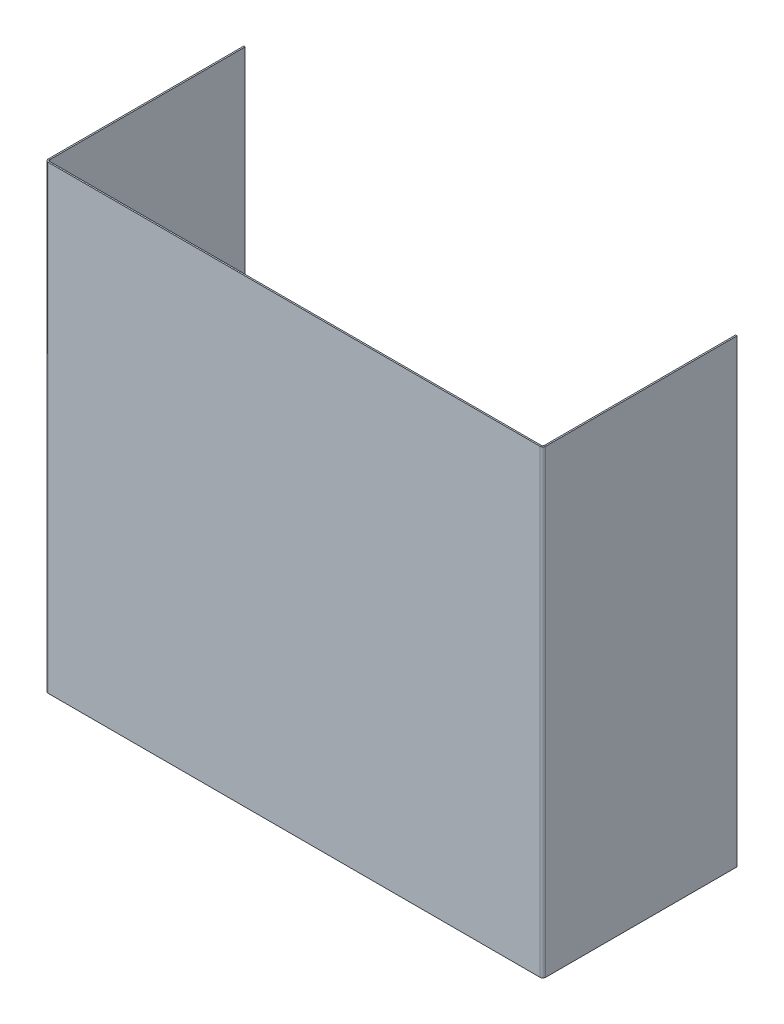
ISO-10303-21;
HEADER;
FILE_DESCRIPTION(('STEP AP214'),'2;1');
FILE_NAME('part.step','',(''),(''),'','','');
FILE_SCHEMA(('AUTOMOTIVE_DESIGN { 1 0 10303 214 1 1 1 1 }'));
ENDSEC;
DATA;
#1=APPLICATION_CONTEXT('core data for automotive mechanical design processes');
#2=APPLICATION_PROTOCOL_DEFINITION('international standard','automotive_design',2000,#1);
#3=PRODUCT_CONTEXT('',#1,'mechanical');
#4=PRODUCT('Part','Part','',(#3));
#5=PRODUCT_RELATED_PRODUCT_CATEGORY('part','',(#4));
#6=PRODUCT_DEFINITION_FORMATION('','',#4);
#7=PRODUCT_DEFINITION_CONTEXT('part definition',#1,'design');
#8=PRODUCT_DEFINITION('design','',#6,#7);
#9=PRODUCT_DEFINITION_SHAPE('','',#8);
#10=(LENGTH_UNIT() NAMED_UNIT(*) SI_UNIT(.MILLI.,.METRE.));
#11=(NAMED_UNIT(*) PLANE_ANGLE_UNIT() SI_UNIT($,.RADIAN.));
#12=(NAMED_UNIT(*) SI_UNIT($,.STERADIAN.) SOLID_ANGLE_UNIT());
#13=UNCERTAINTY_MEASURE_WITH_UNIT(LENGTH_MEASURE(1.E-05),#10,'distance_accuracy_value','');
#14=(GEOMETRIC_REPRESENTATION_CONTEXT(3) GLOBAL_UNCERTAINTY_ASSIGNED_CONTEXT((#13)) GLOBAL_UNIT_ASSIGNED_CONTEXT((#10,
#11,#12)) REPRESENTATION_CONTEXT('',''));
#15=CARTESIAN_POINT('',(0.,0.,0.));
#16=DIRECTION('',(0.,0.,1.));
#17=DIRECTION('',(1.,0.,0.));
#18=AXIS2_PLACEMENT_3D('',#15,#16,#17);
#19=CARTESIAN_POINT('',(0.736600000000012,238.,102.));
#20=DIRECTION('',(0.,1.,0.));
#21=DIRECTION('',(0.,0.,1.));
#22=AXIS2_PLACEMENT_3D('',#19,#20,#21);
#23=PLANE('',#22);
#24=DIRECTION('',(0.,0.,1.));
#25=VECTOR('',#24,1.);
#26=CARTESIAN_POINT('',(0.736600000000012,238.,102.));
#27=LINE('',#26,#25);
#28=CARTESIAN_POINT('',(0.736600000000012,238.,102.));
#29=VERTEX_POINT('',#28);
#30=CARTESIAN_POINT('',(0.736600000000012,238.,102.7366));
#31=VERTEX_POINT('',#30);
#32=EDGE_CURVE('E11',#29,#31,#27,.T.);
#33=ORIENTED_EDGE('',*,*,#32,.F.);
#34=CARTESIAN_POINT('',(0.736600000000012,238.,101.2634));
#35=DIRECTION('',(0.,-1.,0.));
#36=DIRECTION('',(0.,0.,-1.));
#37=AXIS2_PLACEMENT_3D('',#34,#35,#36);
#38=CIRCLE('',#37,0.7366);
#39=CARTESIAN_POINT('',(0.,238.,101.2634));
#40=VERTEX_POINT('',#39);
#41=EDGE_CURVE('E249',#40,#29,#38,.F.);
#42=ORIENTED_EDGE('',*,*,#41,.F.);
#43=DIRECTION('',(1.,0.,0.));
#44=VECTOR('',#43,1.);
#45=CARTESIAN_POINT('',(-0.736599999999988,238.,101.2634));
#46=LINE('',#45,#44);
#47=CARTESIAN_POINT('',(-0.736599999999988,238.,101.2634));
#48=VERTEX_POINT('',#47);
#49=EDGE_CURVE('E47',#48,#40,#46,.T.);
#50=ORIENTED_EDGE('',*,*,#49,.F.);
#51=CARTESIAN_POINT('',(0.736600000000012,238.,101.2634));
#52=DIRECTION('',(0.,1.,0.));
#53=DIRECTION('',(1.,0.,0.));
#54=AXIS2_PLACEMENT_3D('',#51,#52,#53);
#55=CIRCLE('',#54,1.4732);
#56=EDGE_CURVE('E148',#48,#31,#55,.T.);
#57=ORIENTED_EDGE('',*,*,#56,.T.);
#58=EDGE_LOOP('',(#33,#42,#50,#57));
#59=FACE_BOUND('',#58,.T.);
#60=ADVANCED_FACE('F39',(#59),#23,.T.);
#61=CARTESIAN_POINT('',(-0.736599999999988,238.,101.2634));
#62=DIRECTION('',(0.,1.,0.));
#63=DIRECTION('',(0.,0.,1.));
#64=AXIS2_PLACEMENT_3D('',#61,#62,#63);
#65=PLANE('',#64);
#66=DIRECTION('',(1.,0.,0.));
#67=VECTOR('',#66,1.);
#68=CARTESIAN_POINT('',(0.,238.,102.));
#69=LINE('',#68,#67);
#70=CARTESIAN_POINT('',(255.2634,238.,102.));
#71=VERTEX_POINT('',#70);
#72=EDGE_CURVE('E142',#29,#71,#69,.T.);
#73=ORIENTED_EDGE('',*,*,#72,.F.);
#74=ORIENTED_EDGE('',*,*,#32,.T.);
#75=DIRECTION('',(1.,0.,0.));
#76=VECTOR('',#75,1.);
#77=CARTESIAN_POINT('',(0.,238.,102.7366));
#78=LINE('',#77,#76);
#79=CARTESIAN_POINT('',(255.2634,238.,102.7366));
#80=VERTEX_POINT('',#79);
#81=EDGE_CURVE('E139',#31,#80,#78,.T.);
#82=ORIENTED_EDGE('',*,*,#81,.T.);
#83=DIRECTION('',(0.,0.,-1.));
#84=VECTOR('',#83,1.);
#85=CARTESIAN_POINT('',(255.2634,238.,102.7366));
#86=LINE('',#85,#84);
#87=EDGE_CURVE('E230',#80,#71,#86,.T.);
#88=ORIENTED_EDGE('',*,*,#87,.T.);
#89=EDGE_LOOP('',(#73,#74,#82,#88));
#90=FACE_BOUND('',#89,.T.);
#91=ADVANCED_FACE('F137',(#90),#65,.T.);
#92=CARTESIAN_POINT('',(0.,0.,101.2634));
#93=DIRECTION('',(0.,-1.,0.));
#94=DIRECTION('',(0.,0.,-1.));
#95=AXIS2_PLACEMENT_3D('',#92,#93,#94);
#96=PLANE('',#95);
#97=DIRECTION('',(-1.,0.,0.));
#98=VECTOR('',#97,1.);
#99=CARTESIAN_POINT('',(0.,0.,101.2634));
#100=LINE('',#99,#98);
#101=CARTESIAN_POINT('',(0.,0.,101.2634));
#102=VERTEX_POINT('',#101);
#103=CARTESIAN_POINT('',(-0.736599999999988,0.,101.2634));
#104=VERTEX_POINT('',#103);
#105=EDGE_CURVE('E235',#102,#104,#100,.T.);
#106=ORIENTED_EDGE('',*,*,#105,.F.);
#107=CARTESIAN_POINT('',(0.736600000000012,0.,101.2634));
#108=DIRECTION('',(0.,-1.,0.));
#109=DIRECTION('',(0.,0.,-1.));
#110=AXIS2_PLACEMENT_3D('',#107,#108,#109);
#111=CIRCLE('',#110,0.7366);
#112=CARTESIAN_POINT('',(0.736600000000012,0.,102.));
#113=VERTEX_POINT('',#112);
#114=EDGE_CURVE('E187',#102,#113,#111,.F.);
#115=ORIENTED_EDGE('',*,*,#114,.T.);
#116=DIRECTION('',(0.,0.,-1.));
#117=VECTOR('',#116,1.);
#118=CARTESIAN_POINT('',(0.736600000000012,0.,102.7366));
#119=LINE('',#118,#117);
#120=CARTESIAN_POINT('',(0.736600000000012,0.,102.7366));
#121=VERTEX_POINT('',#120);
#122=EDGE_CURVE('E233',#121,#113,#119,.T.);
#123=ORIENTED_EDGE('',*,*,#122,.F.);
#124=CARTESIAN_POINT('',(0.736600000000012,0.,101.2634));
#125=DIRECTION('',(0.,1.,0.));
#126=DIRECTION('',(1.,0.,0.));
#127=AXIS2_PLACEMENT_3D('',#124,#125,#126);
#128=CIRCLE('',#127,1.4732);
#129=EDGE_CURVE('E160',#104,#121,#128,.T.);
#130=ORIENTED_EDGE('',*,*,#129,.F.);
#131=EDGE_LOOP('',(#106,#115,#123,#130));
#132=FACE_BOUND('',#131,.T.);
#133=ADVANCED_FACE('F287',(#132),#96,.T.);
#134=CARTESIAN_POINT('',(0.736600000000012,0.,102.7366));
#135=DIRECTION('',(0.,-1.,0.));
#136=DIRECTION('',(0.,0.,-1.));
#137=AXIS2_PLACEMENT_3D('',#134,#135,#136);
#138=PLANE('',#137);
#139=DIRECTION('',(0.,0.,1.));
#140=VECTOR('',#139,1.);
#141=CARTESIAN_POINT('',(0.,0.,0.));
#142=LINE('',#141,#140);
#143=CARTESIAN_POINT('',(0.,0.,0.));
#144=VERTEX_POINT('',#143);
#145=EDGE_CURVE('E190',#144,#102,#142,.T.);
#146=ORIENTED_EDGE('',*,*,#145,.T.);
#147=ORIENTED_EDGE('',*,*,#105,.T.);
#148=DIRECTION('',(0.,0.,1.));
#149=VECTOR('',#148,1.);
#150=CARTESIAN_POINT('',(-0.7366,0.,0.));
#151=LINE('',#150,#149);
#152=CARTESIAN_POINT('',(-0.7366,0.,0.));
#153=VERTEX_POINT('',#152);
#154=EDGE_CURVE('E196',#153,#104,#151,.T.);
#155=ORIENTED_EDGE('',*,*,#154,.F.);
#156=DIRECTION('',(1.,0.,0.));
#157=VECTOR('',#156,1.);
#158=CARTESIAN_POINT('',(-0.7366,0.,0.));
#159=LINE('',#158,#157);
#160=EDGE_CURVE('E193',#153,#144,#159,.T.);
#161=ORIENTED_EDGE('',*,*,#160,.T.);
#162=EDGE_LOOP('',(#146,#147,#155,#161));
#163=FACE_BOUND('',#162,.T.);
#164=ADVANCED_FACE('F290',(#163),#138,.T.);
#165=CARTESIAN_POINT('',(256.,238.,101.2634));
#166=DIRECTION('',(0.,1.,0.));
#167=DIRECTION('',(0.,0.,1.));
#168=AXIS2_PLACEMENT_3D('',#165,#166,#167);
#169=PLANE('',#168);
#170=DIRECTION('',(1.,0.,0.));
#171=VECTOR('',#170,1.);
#172=CARTESIAN_POINT('',(256.,238.,101.2634));
#173=LINE('',#172,#171);
#174=CARTESIAN_POINT('',(256.,238.,101.2634));
#175=VERTEX_POINT('',#174);
#176=CARTESIAN_POINT('',(256.7366,238.,101.2634));
#177=VERTEX_POINT('',#176);
#178=EDGE_CURVE('E55',#175,#177,#173,.T.);
#179=ORIENTED_EDGE('',*,*,#178,.F.);
#180=CARTESIAN_POINT('',(255.2634,238.,101.2634));
#181=DIRECTION('',(0.,-1.,0.));
#182=DIRECTION('',(0.,0.,-1.));
#183=AXIS2_PLACEMENT_3D('',#180,#181,#182);
#184=CIRCLE('',#183,0.7366);
#185=EDGE_CURVE('E259',#71,#175,#184,.F.);
#186=ORIENTED_EDGE('',*,*,#185,.F.);
#187=ORIENTED_EDGE('',*,*,#87,.F.);
#188=CARTESIAN_POINT('',(255.2634,238.,101.2634));
#189=DIRECTION('',(0.,1.,0.));
#190=DIRECTION('',(1.,0.,0.));
#191=AXIS2_PLACEMENT_3D('',#188,#189,#190);
#192=CIRCLE('',#191,1.4732);
#193=EDGE_CURVE('E168',#80,#177,#192,.T.);
#194=ORIENTED_EDGE('',*,*,#193,.T.);
#195=EDGE_LOOP('',(#179,#186,#187,#194));
#196=FACE_BOUND('',#195,.T.);
#197=ADVANCED_FACE('F282',(#196),#169,.T.);
#198=CARTESIAN_POINT('',(255.2634,238.,102.7366));
#199=DIRECTION('',(0.,1.,0.));
#200=DIRECTION('',(0.,0.,1.));
#201=AXIS2_PLACEMENT_3D('',#198,#199,#200);
#202=PLANE('',#201);
#203=DIRECTION('',(0.,0.,-1.));
#204=VECTOR('',#203,1.);
#205=CARTESIAN_POINT('',(256.,238.,102.));
#206=LINE('',#205,#204);
#207=CARTESIAN_POINT('',(256.,238.,2.24999999999997));
#208=VERTEX_POINT('',#207);
#209=EDGE_CURVE('E262',#175,#208,#206,.T.);
#210=ORIENTED_EDGE('',*,*,#209,.F.);
#211=ORIENTED_EDGE('',*,*,#178,.T.);
#212=DIRECTION('',(0.,0.,-1.));
#213=VECTOR('',#212,1.);
#214=CARTESIAN_POINT('',(256.7366,238.,102.));
#215=LINE('',#214,#213);
#216=CARTESIAN_POINT('',(256.7366,238.,2.24999999999997));
#217=VERTEX_POINT('',#216);
#218=EDGE_CURVE('E109',#177,#217,#215,.T.);
#219=ORIENTED_EDGE('',*,*,#218,.T.);
#220=DIRECTION('',(1.,0.,0.));
#221=VECTOR('',#220,1.);
#222=CARTESIAN_POINT('',(256.,238.,2.24999999999997));
#223=LINE('',#222,#221);
#224=EDGE_CURVE('E265',#208,#217,#223,.T.);
#225=ORIENTED_EDGE('',*,*,#224,.F.);
#226=EDGE_LOOP('',(#210,#211,#219,#225));
#227=FACE_BOUND('',#226,.T.);
#228=ADVANCED_FACE('F271',(#227),#202,.T.);
#229=CARTESIAN_POINT('',(255.2634,0.,102.));
#230=DIRECTION('',(0.,-1.,0.));
#231=DIRECTION('',(0.,0.,-1.));
#232=AXIS2_PLACEMENT_3D('',#229,#230,#231);
#233=PLANE('',#232);
#234=DIRECTION('',(0.,0.,1.));
#235=VECTOR('',#234,1.);
#236=CARTESIAN_POINT('',(255.2634,0.,102.));
#237=LINE('',#236,#235);
#238=CARTESIAN_POINT('',(255.2634,0.,102.));
#239=VERTEX_POINT('',#238);
#240=CARTESIAN_POINT('',(255.2634,0.,102.7366));
#241=VERTEX_POINT('',#240);
#242=EDGE_CURVE('E96',#239,#241,#237,.T.);
#243=ORIENTED_EDGE('',*,*,#242,.F.);
#244=CARTESIAN_POINT('',(255.2634,0.,101.2634));
#245=DIRECTION('',(0.,-1.,0.));
#246=DIRECTION('',(0.,0.,-1.));
#247=AXIS2_PLACEMENT_3D('',#244,#245,#246);
#248=CIRCLE('',#247,0.7366);
#249=CARTESIAN_POINT('',(256.,0.,101.2634));
#250=VERTEX_POINT('',#249);
#251=EDGE_CURVE('E183',#239,#250,#248,.F.);
#252=ORIENTED_EDGE('',*,*,#251,.T.);
#253=DIRECTION('',(-1.,0.,0.));
#254=VECTOR('',#253,1.);
#255=CARTESIAN_POINT('',(256.7366,0.,101.2634));
#256=LINE('',#255,#254);
#257=CARTESIAN_POINT('',(256.7366,0.,101.2634));
#258=VERTEX_POINT('',#257);
#259=EDGE_CURVE('E103',#258,#250,#256,.T.);
#260=ORIENTED_EDGE('',*,*,#259,.F.);
#261=CARTESIAN_POINT('',(255.2634,0.,101.2634));
#262=DIRECTION('',(0.,1.,0.));
#263=DIRECTION('',(1.,0.,0.));
#264=AXIS2_PLACEMENT_3D('',#261,#262,#263);
#265=CIRCLE('',#264,1.4732);
#266=EDGE_CURVE('E202',#241,#258,#265,.T.);
#267=ORIENTED_EDGE('',*,*,#266,.F.);
#268=EDGE_LOOP('',(#243,#252,#260,#267));
#269=FACE_BOUND('',#268,.T.);
#270=ADVANCED_FACE('F319',(#269),#233,.T.);
#271=CARTESIAN_POINT('',(256.7366,0.,101.2634));
#272=DIRECTION('',(0.,-1.,0.));
#273=DIRECTION('',(0.,0.,-1.));
#274=AXIS2_PLACEMENT_3D('',#271,#272,#273);
#275=PLANE('',#274);
#276=DIRECTION('',(1.,0.,0.));
#277=VECTOR('',#276,1.);
#278=CARTESIAN_POINT('',(0.,0.,102.));
#279=LINE('',#278,#277);
#280=EDGE_CURVE('E185',#113,#239,#279,.T.);
#281=ORIENTED_EDGE('',*,*,#280,.T.);
#282=ORIENTED_EDGE('',*,*,#242,.T.);
#283=DIRECTION('',(1.,0.,0.));
#284=VECTOR('',#283,1.);
#285=CARTESIAN_POINT('',(0.,0.,102.7366));
#286=LINE('',#285,#284);
#287=EDGE_CURVE('E200',#121,#241,#286,.T.);
#288=ORIENTED_EDGE('',*,*,#287,.F.);
#289=ORIENTED_EDGE('',*,*,#122,.T.);
#290=EDGE_LOOP('',(#281,#282,#288,#289));
#291=FACE_BOUND('',#290,.T.);
#292=ADVANCED_FACE('F322',(#291),#275,.T.);
#293=CARTESIAN_POINT('',(256.7366,238.,102.));
#294=DIRECTION('',(-1.,0.,0.));
#295=DIRECTION('',(0.,0.,1.));
#296=AXIS2_PLACEMENT_3D('',#293,#294,#295);
#297=PLANE('',#296);
#298=DIRECTION('',(0.,0.,-1.));
#299=VECTOR('',#298,1.);
#300=CARTESIAN_POINT('',(256.7366,0.,102.));
#301=LINE('',#300,#299);
#302=CARTESIAN_POINT('',(256.7366,0.,2.24999999999997));
#303=VERTEX_POINT('',#302);
#304=EDGE_CURVE('E174',#258,#303,#301,.T.);
#305=ORIENTED_EDGE('',*,*,#304,.T.);
#306=DIRECTION('',(0.,-1.,0.));
#307=VECTOR('',#306,1.);
#308=CARTESIAN_POINT('',(256.7366,238.,2.24999999999997));
#309=LINE('',#308,#307);
#310=EDGE_CURVE('E226',#217,#303,#309,.T.);
#311=ORIENTED_EDGE('',*,*,#310,.F.);
#312=ORIENTED_EDGE('',*,*,#218,.F.);
#313=DIRECTION('',(0.,-1.,0.));
#314=VECTOR('',#313,1.);
#315=CARTESIAN_POINT('',(256.7366,238.,101.2634));
#316=LINE('',#315,#314);
#317=EDGE_CURVE('E170',#177,#258,#316,.T.);
#318=ORIENTED_EDGE('',*,*,#317,.T.);
#319=EDGE_LOOP('',(#305,#311,#312,#318));
#320=FACE_BOUND('',#319,.T.);
#321=ADVANCED_FACE('F325',(#320),#297,.F.);
#322=CARTESIAN_POINT('',(256.,238.,2.24999999999997));
#323=DIRECTION('',(0.,0.,-1.));
#324=DIRECTION('',(-1.,0.,0.));
#325=AXIS2_PLACEMENT_3D('',#322,#323,#324);
#326=PLANE('',#325);
#327=DIRECTION('',(1.,0.,0.));
#328=VECTOR('',#327,1.);
#329=CARTESIAN_POINT('',(256.,0.,2.24999999999997));
#330=LINE('',#329,#328);
#331=CARTESIAN_POINT('',(256.,0.,2.24999999999997));
#332=VERTEX_POINT('',#331);
#333=EDGE_CURVE('E177',#332,#303,#330,.T.);
#334=ORIENTED_EDGE('',*,*,#333,.F.);
#335=DIRECTION('',(0.,-1.,0.));
#336=VECTOR('',#335,1.);
#337=CARTESIAN_POINT('',(256.,238.,2.24999999999997));
#338=LINE('',#337,#336);
#339=EDGE_CURVE('E224',#208,#332,#338,.T.);
#340=ORIENTED_EDGE('',*,*,#339,.F.);
#341=ORIENTED_EDGE('',*,*,#224,.T.);
#342=ORIENTED_EDGE('',*,*,#310,.T.);
#343=EDGE_LOOP('',(#334,#340,#341,#342));
#344=FACE_BOUND('',#343,.T.);
#345=ADVANCED_FACE('F270',(#344),#326,.T.);
#346=CARTESIAN_POINT('',(256.,238.,102.));
#347=DIRECTION('',(-1.,0.,0.));
#348=DIRECTION('',(0.,0.,1.));
#349=AXIS2_PLACEMENT_3D('',#346,#347,#348);
#350=PLANE('',#349);
#351=DIRECTION('',(0.,0.,-1.));
#352=VECTOR('',#351,1.);
#353=CARTESIAN_POINT('',(256.,0.,102.));
#354=LINE('',#353,#352);
#355=EDGE_CURVE('E180',#250,#332,#354,.T.);
#356=ORIENTED_EDGE('',*,*,#355,.F.);
#357=DIRECTION('',(0.,-1.,0.));
#358=VECTOR('',#357,1.);
#359=CARTESIAN_POINT('',(256.,238.,101.2634));
#360=LINE('',#359,#358);
#361=EDGE_CURVE('E221',#175,#250,#360,.T.);
#362=ORIENTED_EDGE('',*,*,#361,.F.);
#363=ORIENTED_EDGE('',*,*,#209,.T.);
#364=ORIENTED_EDGE('',*,*,#339,.T.);
#365=EDGE_LOOP('',(#356,#362,#363,#364));
#366=FACE_BOUND('',#365,.T.);
#367=ADVANCED_FACE('F275',(#366),#350,.T.);
#368=CARTESIAN_POINT('',(255.2634,238.,101.2634));
#369=DIRECTION('',(0.,-1.,0.));
#370=DIRECTION('',(0.,0.,-1.));
#371=AXIS2_PLACEMENT_3D('',#368,#369,#370);
#372=CYLINDRICAL_SURFACE('',#371,0.7366);
#373=ORIENTED_EDGE('',*,*,#251,.F.);
#374=DIRECTION('',(0.,-1.,0.));
#375=VECTOR('',#374,1.);
#376=CARTESIAN_POINT('',(255.2634,238.,102.));
#377=LINE('',#376,#375);
#378=EDGE_CURVE('E218',#71,#239,#377,.T.);
#379=ORIENTED_EDGE('',*,*,#378,.F.);
#380=ORIENTED_EDGE('',*,*,#185,.T.);
#381=ORIENTED_EDGE('',*,*,#361,.T.);
#382=EDGE_LOOP('',(#373,#379,#380,#381));
#383=FACE_BOUND('',#382,.T.);
#384=ADVANCED_FACE('F278',(#383),#372,.F.);
#385=CARTESIAN_POINT('',(0.,238.,102.));
#386=DIRECTION('',(0.,0.,-1.));
#387=DIRECTION('',(-1.,0.,0.));
#388=AXIS2_PLACEMENT_3D('',#385,#386,#387);
#389=PLANE('',#388);
#390=ORIENTED_EDGE('',*,*,#280,.F.);
#391=DIRECTION('',(0.,-1.,0.));
#392=VECTOR('',#391,1.);
#393=CARTESIAN_POINT('',(0.736600000000012,238.,102.));
#394=LINE('',#393,#392);
#395=EDGE_CURVE('E215',#29,#113,#394,.T.);
#396=ORIENTED_EDGE('',*,*,#395,.F.);
#397=ORIENTED_EDGE('',*,*,#72,.T.);
#398=ORIENTED_EDGE('',*,*,#378,.T.);
#399=EDGE_LOOP('',(#390,#396,#397,#398));
#400=FACE_BOUND('',#399,.T.);
#401=ADVANCED_FACE('F285',(#400),#389,.T.);
#402=CARTESIAN_POINT('',(0.736600000000012,238.,101.2634));
#403=DIRECTION('',(0.,-1.,0.));
#404=DIRECTION('',(0.,0.,-1.));
#405=AXIS2_PLACEMENT_3D('',#402,#403,#404);
#406=CYLINDRICAL_SURFACE('',#405,0.7366);
#407=ORIENTED_EDGE('',*,*,#114,.F.);
#408=DIRECTION('',(0.,-1.,0.));
#409=VECTOR('',#408,1.);
#410=CARTESIAN_POINT('',(0.,238.,101.2634));
#411=LINE('',#410,#409);
#412=EDGE_CURVE('E212',#40,#102,#411,.T.);
#413=ORIENTED_EDGE('',*,*,#412,.F.);
#414=ORIENTED_EDGE('',*,*,#41,.T.);
#415=ORIENTED_EDGE('',*,*,#395,.T.);
#416=EDGE_LOOP('',(#407,#413,#414,#415));
#417=FACE_BOUND('',#416,.T.);
#418=ADVANCED_FACE('F248',(#417),#406,.F.);
#419=CARTESIAN_POINT('',(0.,238.,0.));
#420=DIRECTION('',(1.,0.,0.));
#421=DIRECTION('',(0.,0.,-1.));
#422=AXIS2_PLACEMENT_3D('',#419,#420,#421);
#423=PLANE('',#422);
#424=ORIENTED_EDGE('',*,*,#145,.F.);
#425=DIRECTION('',(0.,-1.,0.));
#426=VECTOR('',#425,1.);
#427=CARTESIAN_POINT('',(0.,238.,0.));
#428=LINE('',#427,#426);
#429=CARTESIAN_POINT('',(0.,238.,0.));
#430=VERTEX_POINT('',#429);
#431=EDGE_CURVE('E210',#430,#144,#428,.T.);
#432=ORIENTED_EDGE('',*,*,#431,.F.);
#433=DIRECTION('',(0.,0.,1.));
#434=VECTOR('',#433,1.);
#435=CARTESIAN_POINT('',(0.,238.,0.));
#436=LINE('',#435,#434);
#437=EDGE_CURVE('E242',#430,#40,#436,.T.);
#438=ORIENTED_EDGE('',*,*,#437,.T.);
#439=ORIENTED_EDGE('',*,*,#412,.T.);
#440=EDGE_LOOP('',(#424,#432,#438,#439));
#441=FACE_BOUND('',#440,.T.);
#442=ADVANCED_FACE('F253',(#441),#423,.T.);
#443=CARTESIAN_POINT('',(-0.7366,238.,0.));
#444=DIRECTION('',(0.,0.,-1.));
#445=DIRECTION('',(-1.,0.,0.));
#446=AXIS2_PLACEMENT_3D('',#443,#444,#445);
#447=PLANE('',#446);
#448=ORIENTED_EDGE('',*,*,#160,.F.);
#449=DIRECTION('',(0.,-1.,0.));
#450=VECTOR('',#449,1.);
#451=CARTESIAN_POINT('',(-0.7366,238.,0.));
#452=LINE('',#451,#450);
#453=CARTESIAN_POINT('',(-0.7366,238.,0.));
#454=VERTEX_POINT('',#453);
#455=EDGE_CURVE('E208',#454,#153,#452,.T.);
#456=ORIENTED_EDGE('',*,*,#455,.F.);
#457=DIRECTION('',(1.,0.,0.));
#458=VECTOR('',#457,1.);
#459=CARTESIAN_POINT('',(-0.7366,238.,0.));
#460=LINE('',#459,#458);
#461=EDGE_CURVE('E254',#454,#430,#460,.T.);
#462=ORIENTED_EDGE('',*,*,#461,.T.);
#463=ORIENTED_EDGE('',*,*,#431,.T.);
#464=EDGE_LOOP('',(#448,#456,#462,#463));
#465=FACE_BOUND('',#464,.T.);
#466=ADVANCED_FACE('F295',(#465),#447,.T.);
#467=CARTESIAN_POINT('',(-0.7366,238.,0.));
#468=DIRECTION('',(1.,0.,0.));
#469=DIRECTION('',(0.,0.,-1.));
#470=AXIS2_PLACEMENT_3D('',#467,#468,#469);
#471=PLANE('',#470);
#472=ORIENTED_EDGE('',*,*,#154,.T.);
#473=DIRECTION('',(0.,-1.,0.));
#474=VECTOR('',#473,1.);
#475=CARTESIAN_POINT('',(-0.736599999999988,238.,101.2634));
#476=LINE('',#475,#474);
#477=EDGE_CURVE('E162',#48,#104,#476,.T.);
#478=ORIENTED_EDGE('',*,*,#477,.F.);
#479=DIRECTION('',(0.,0.,1.));
#480=VECTOR('',#479,1.);
#481=CARTESIAN_POINT('',(-0.7366,238.,0.));
#482=LINE('',#481,#480);
#483=EDGE_CURVE('E153',#454,#48,#482,.T.);
#484=ORIENTED_EDGE('',*,*,#483,.F.);
#485=ORIENTED_EDGE('',*,*,#455,.T.);
#486=EDGE_LOOP('',(#472,#478,#484,#485));
#487=FACE_BOUND('',#486,.T.);
#488=ADVANCED_FACE('F293',(#487),#471,.F.);
#489=CARTESIAN_POINT('',(0.736600000000012,238.,101.2634));
#490=DIRECTION('',(0.,-1.,0.));
#491=DIRECTION('',(0.,0.,-1.));
#492=AXIS2_PLACEMENT_3D('',#489,#490,#491);
#493=CYLINDRICAL_SURFACE('',#492,1.4732);
#494=ORIENTED_EDGE('',*,*,#129,.T.);
#495=DIRECTION('',(0.,-1.,0.));
#496=VECTOR('',#495,1.);
#497=CARTESIAN_POINT('',(0.736600000000012,238.,102.7366));
#498=LINE('',#497,#496);
#499=EDGE_CURVE('E157',#31,#121,#498,.T.);
#500=ORIENTED_EDGE('',*,*,#499,.F.);
#501=ORIENTED_EDGE('',*,*,#56,.F.);
#502=ORIENTED_EDGE('',*,*,#477,.T.);
#503=EDGE_LOOP('',(#494,#500,#501,#502));
#504=FACE_BOUND('',#503,.T.);
#505=ADVANCED_FACE('F158',(#504),#493,.T.);
#506=CARTESIAN_POINT('',(0.,238.,102.7366));
#507=DIRECTION('',(0.,0.,-1.));
#508=DIRECTION('',(-1.,0.,0.));
#509=AXIS2_PLACEMENT_3D('',#506,#507,#508);
#510=PLANE('',#509);
#511=ORIENTED_EDGE('',*,*,#287,.T.);
#512=DIRECTION('',(0.,-1.,0.));
#513=VECTOR('',#512,1.);
#514=CARTESIAN_POINT('',(255.2634,238.,102.7366));
#515=LINE('',#514,#513);
#516=EDGE_CURVE('E163',#80,#241,#515,.T.);
#517=ORIENTED_EDGE('',*,*,#516,.F.);
#518=ORIENTED_EDGE('',*,*,#81,.F.);
#519=ORIENTED_EDGE('',*,*,#499,.T.);
#520=EDGE_LOOP('',(#511,#517,#518,#519));
#521=FACE_BOUND('',#520,.T.);
#522=ADVANCED_FACE('F165',(#521),#510,.F.);
#523=CARTESIAN_POINT('',(255.2634,238.,101.2634));
#524=DIRECTION('',(0.,-1.,0.));
#525=DIRECTION('',(0.,0.,-1.));
#526=AXIS2_PLACEMENT_3D('',#523,#524,#525);
#527=CYLINDRICAL_SURFACE('',#526,1.4732);
#528=ORIENTED_EDGE('',*,*,#266,.T.);
#529=ORIENTED_EDGE('',*,*,#317,.F.);
#530=ORIENTED_EDGE('',*,*,#193,.F.);
#531=ORIENTED_EDGE('',*,*,#516,.T.);
#532=EDGE_LOOP('',(#528,#529,#530,#531));
#533=FACE_BOUND('',#532,.T.);
#534=ADVANCED_FACE('F377',(#533),#527,.T.);
#535=CARTESIAN_POINT('',(255.2634,238.,101.2634));
#536=DIRECTION('',(0.,-1.,0.));
#537=DIRECTION('',(-1.,0.,0.));
#538=AXIS2_PLACEMENT_3D('',#535,#536,#537);
#539=PLANE('',#538);
#540=ORIENTED_EDGE('',*,*,#483,.T.);
#541=ORIENTED_EDGE('',*,*,#49,.T.);
#542=ORIENTED_EDGE('',*,*,#437,.F.);
#543=ORIENTED_EDGE('',*,*,#461,.F.);
#544=EDGE_LOOP('',(#540,#541,#542,#543));
#545=FACE_BOUND('',#544,.T.);
#546=ADVANCED_FACE('F239',(#545),#539,.F.);
#547=CARTESIAN_POINT('',(255.2634,0.,101.2634));
#548=DIRECTION('',(0.,-1.,0.));
#549=DIRECTION('',(-1.,0.,0.));
#550=AXIS2_PLACEMENT_3D('',#547,#548,#549);
#551=PLANE('',#550);
#552=ORIENTED_EDGE('',*,*,#304,.F.);
#553=ORIENTED_EDGE('',*,*,#259,.T.);
#554=ORIENTED_EDGE('',*,*,#355,.T.);
#555=ORIENTED_EDGE('',*,*,#333,.T.);
#556=EDGE_LOOP('',(#552,#553,#554,#555));
#557=FACE_BOUND('',#556,.T.);
#558=ADVANCED_FACE('F397',(#557),#551,.T.);
#559=CLOSED_SHELL('',(#60,#91,#133,#164,#197,#228,#270,#292,#321,#345,#367,#384,#401,#418,#442,
#466,#488,#505,#522,#534,#546,#558));
#560=MANIFOLD_SOLID_BREP('B2',#559);
#561=ADVANCED_BREP_SHAPE_REPRESENTATION('',(#18,#560),#14);
#562=SHAPE_DEFINITION_REPRESENTATION(#9,#561);
ENDSEC;
END-ISO-10303-21;
